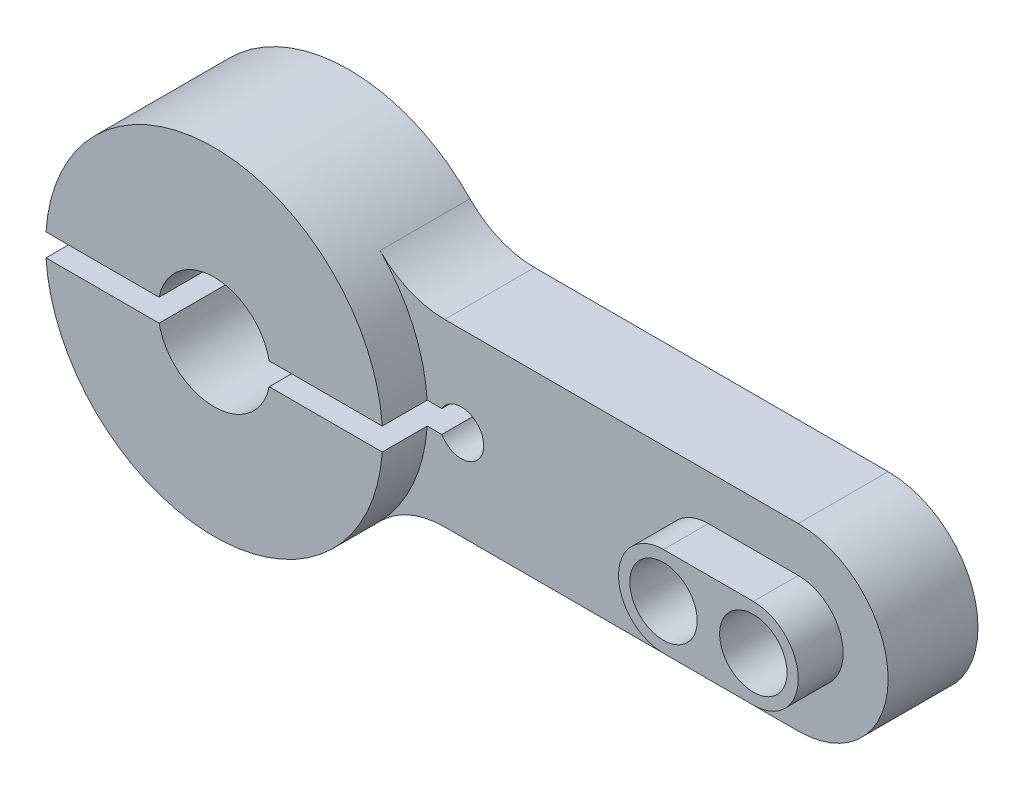
ISO-10303-21;
HEADER;
FILE_DESCRIPTION(('STEP AP214'),'2;1');
FILE_NAME('part.step','',(''),(''),'','','');
FILE_SCHEMA(('AUTOMOTIVE_DESIGN { 1 0 10303 214 1 1 1 1 }'));
ENDSEC;
DATA;
#1=APPLICATION_CONTEXT('core data for automotive mechanical design processes');
#2=APPLICATION_PROTOCOL_DEFINITION('international standard','automotive_design',2000,#1);
#3=PRODUCT_CONTEXT('',#1,'mechanical');
#4=PRODUCT('Part','Part','',(#3));
#5=PRODUCT_RELATED_PRODUCT_CATEGORY('part','',(#4));
#6=PRODUCT_DEFINITION_FORMATION('','',#4);
#7=PRODUCT_DEFINITION_CONTEXT('part definition',#1,'design');
#8=PRODUCT_DEFINITION('design','',#6,#7);
#9=PRODUCT_DEFINITION_SHAPE('','',#8);
#10=(LENGTH_UNIT() NAMED_UNIT(*) SI_UNIT(.MILLI.,.METRE.));
#11=(NAMED_UNIT(*) PLANE_ANGLE_UNIT() SI_UNIT($,.RADIAN.));
#12=(NAMED_UNIT(*) SI_UNIT($,.STERADIAN.) SOLID_ANGLE_UNIT());
#13=UNCERTAINTY_MEASURE_WITH_UNIT(LENGTH_MEASURE(1.E-05),#10,'distance_accuracy_value','');
#14=(GEOMETRIC_REPRESENTATION_CONTEXT(3) GLOBAL_UNCERTAINTY_ASSIGNED_CONTEXT((#13)) GLOBAL_UNIT_ASSIGNED_CONTEXT((#10,
#11,#12)) REPRESENTATION_CONTEXT('',''));
#15=CARTESIAN_POINT('',(0.,0.,0.));
#16=DIRECTION('',(0.,0.,1.));
#17=DIRECTION('',(1.,0.,0.));
#18=AXIS2_PLACEMENT_3D('',#15,#16,#17);
#19=CARTESIAN_POINT('',(0.,0.,0.));
#20=DIRECTION('',(0.,0.,1.));
#21=DIRECTION('',(1.,0.,0.));
#22=AXIS2_PLACEMENT_3D('',#19,#20,#21);
#23=CYLINDRICAL_SURFACE('',#22,2.5);
#24=CARTESIAN_POINT('',(0.,0.,2.032));
#25=DIRECTION('',(0.,0.,-1.));
#26=DIRECTION('',(-1.,0.,0.));
#27=AXIS2_PLACEMENT_3D('',#24,#25,#26);
#28=CIRCLE('',#27,2.5);
#29=CARTESIAN_POINT('',(2.44948974278318,-0.5,2.032));
#30=VERTEX_POINT('',#29);
#31=CARTESIAN_POINT('',(-2.44948974278318,-0.5,2.032));
#32=VERTEX_POINT('',#31);
#33=EDGE_CURVE('E239',#30,#32,#28,.T.);
#34=ORIENTED_EDGE('',*,*,#33,.T.);
#35=DIRECTION('',(0.,0.,1.));
#36=VECTOR('',#35,1.);
#37=CARTESIAN_POINT('',(-2.44948974278318,-0.5,0.));
#38=LINE('',#37,#36);
#39=CARTESIAN_POINT('',(-2.44948974278318,-0.5,6.));
#40=VERTEX_POINT('',#39);
#41=EDGE_CURVE('E429',#32,#40,#38,.T.);
#42=ORIENTED_EDGE('',*,*,#41,.T.);
#43=CARTESIAN_POINT('',(0.,0.,6.));
#44=DIRECTION('',(0.,0.,1.));
#45=DIRECTION('',(1.,0.,0.));
#46=AXIS2_PLACEMENT_3D('',#43,#44,#45);
#47=CIRCLE('',#46,2.5);
#48=CARTESIAN_POINT('',(2.44948974278318,-0.5,6.));
#49=VERTEX_POINT('',#48);
#50=EDGE_CURVE('E320',#40,#49,#47,.T.);
#51=ORIENTED_EDGE('',*,*,#50,.T.);
#52=DIRECTION('',(0.,0.,1.));
#53=VECTOR('',#52,1.);
#54=CARTESIAN_POINT('',(2.44948974278318,-0.5,0.));
#55=LINE('',#54,#53);
#56=EDGE_CURVE('E44',#49,#30,#55,.F.);
#57=ORIENTED_EDGE('',*,*,#56,.T.);
#58=EDGE_LOOP('',(#34,#42,#51,#57));
#59=FACE_BOUND('',#58,.T.);
#60=ADVANCED_FACE('F36',(#59),#23,.F.);
#61=CARTESIAN_POINT('',(0.,0.,0.762));
#62=DIRECTION('',(0.,0.,-1.));
#63=DIRECTION('',(1.,0.,0.));
#64=AXIS2_PLACEMENT_3D('',#61,#62,#63);
#65=CIRCLE('',#64,2.5);
#66=CARTESIAN_POINT('',(-2.44948974278318,0.5,0.762));
#67=VERTEX_POINT('',#66);
#68=CARTESIAN_POINT('',(2.44948974278318,0.5,0.762));
#69=VERTEX_POINT('',#68);
#70=EDGE_CURVE('E253',#67,#69,#65,.T.);
#71=ORIENTED_EDGE('',*,*,#70,.F.);
#72=DIRECTION('',(0.,0.,1.));
#73=VECTOR('',#72,1.);
#74=CARTESIAN_POINT('',(-2.44948974278318,0.5,0.));
#75=LINE('',#74,#73);
#76=CARTESIAN_POINT('',(-2.44948974278318,0.5,0.));
#77=VERTEX_POINT('',#76);
#78=EDGE_CURVE('E426',#67,#77,#75,.F.);
#79=ORIENTED_EDGE('',*,*,#78,.T.);
#80=CARTESIAN_POINT('',(0.,0.,0.));
#81=DIRECTION('',(0.,0.,1.));
#82=DIRECTION('',(1.,0.,0.));
#83=AXIS2_PLACEMENT_3D('',#80,#81,#82);
#84=CIRCLE('',#83,2.5);
#85=CARTESIAN_POINT('',(2.44948974278318,0.5,0.));
#86=VERTEX_POINT('',#85);
#87=EDGE_CURVE('E328',#86,#77,#84,.T.);
#88=ORIENTED_EDGE('',*,*,#87,.F.);
#89=DIRECTION('',(0.,0.,1.));
#90=VECTOR('',#89,1.);
#91=CARTESIAN_POINT('',(2.44948974278318,0.5,0.));
#92=LINE('',#91,#90);
#93=EDGE_CURVE('E424',#86,#69,#92,.T.);
#94=ORIENTED_EDGE('',*,*,#93,.T.);
#95=EDGE_LOOP('',(#71,#79,#88,#94));
#96=FACE_BOUND('',#95,.T.);
#97=ADVANCED_FACE('F457',(#96),#23,.F.);
#98=CARTESIAN_POINT('',(0.,0.,6.));
#99=DIRECTION('',(0.,0.,-1.));
#100=DIRECTION('',(-1.,0.,0.));
#101=AXIS2_PLACEMENT_3D('',#98,#99,#100);
#102=CYLINDRICAL_SURFACE('',#101,7.5);
#103=CARTESIAN_POINT('',(0.,0.,6.));
#104=DIRECTION('',(0.,0.,1.));
#105=DIRECTION('',(1.,0.,0.));
#106=AXIS2_PLACEMENT_3D('',#103,#104,#105);
#107=CIRCLE('',#106,7.5);
#108=CARTESIAN_POINT('',(-7.48331477354788,-0.5,6.));
#109=VERTEX_POINT('',#108);
#110=CARTESIAN_POINT('',(7.48331477354788,-0.5,6.));
#111=VERTEX_POINT('',#110);
#112=EDGE_CURVE('E392',#109,#111,#107,.T.);
#113=ORIENTED_EDGE('',*,*,#112,.F.);
#114=DIRECTION('',(0.,0.,-1.));
#115=VECTOR('',#114,1.);
#116=CARTESIAN_POINT('',(-7.48331477354788,-0.5,6.));
#117=LINE('',#116,#115);
#118=CARTESIAN_POINT('',(-7.48331477354788,-0.5,0.));
#119=VERTEX_POINT('',#118);
#120=EDGE_CURVE('E317',#109,#119,#117,.T.);
#121=ORIENTED_EDGE('',*,*,#120,.T.);
#122=CARTESIAN_POINT('',(0.,0.,0.));
#123=DIRECTION('',(0.,0.,1.));
#124=DIRECTION('',(1.,0.,0.));
#125=AXIS2_PLACEMENT_3D('',#122,#123,#124);
#126=CIRCLE('',#125,7.5);
#127=CARTESIAN_POINT('',(5.38784075277988,-5.21739130434783,0.));
#128=VERTEX_POINT('',#127);
#129=EDGE_CURVE('E387',#119,#128,#126,.T.);
#130=ORIENTED_EDGE('',*,*,#129,.T.);
#131=DIRECTION('',(0.,0.,-1.));
#132=VECTOR('',#131,1.);
#133=CARTESIAN_POINT('',(5.38784075277988,-5.21739130434783,6.));
#134=LINE('',#133,#132);
#135=CARTESIAN_POINT('',(5.38784075277988,-5.21739130434783,4.));
#136=VERTEX_POINT('',#135);
#137=EDGE_CURVE('E412',#128,#136,#134,.F.);
#138=ORIENTED_EDGE('',*,*,#137,.T.);
#139=CARTESIAN_POINT('',(0.,0.,4.));
#140=DIRECTION('',(0.,0.,-1.));
#141=DIRECTION('',(1.,0.,0.));
#142=AXIS2_PLACEMENT_3D('',#139,#140,#141);
#143=CIRCLE('',#142,7.5);
#144=CARTESIAN_POINT('',(7.48331477354788,-0.500000000000001,4.));
#145=VERTEX_POINT('',#144);
#146=EDGE_CURVE('E383',#145,#136,#143,.T.);
#147=ORIENTED_EDGE('',*,*,#146,.F.);
#148=DIRECTION('',(0.,0.,-1.));
#149=VECTOR('',#148,1.);
#150=CARTESIAN_POINT('',(7.48331477354788,-0.5,6.));
#151=LINE('',#150,#149);
#152=EDGE_CURVE('E314',#145,#111,#151,.F.);
#153=ORIENTED_EDGE('',*,*,#152,.T.);
#154=EDGE_LOOP('',(#113,#121,#130,#138,#147,#153));
#155=FACE_BOUND('',#154,.T.);
#156=ADVANCED_FACE('F449',(#155),#102,.T.);
#157=CARTESIAN_POINT('',(0.,0.,6.));
#158=DIRECTION('',(0.,0.,1.));
#159=DIRECTION('',(1.,0.,0.));
#160=AXIS2_PLACEMENT_3D('',#157,#158,#159);
#161=PLANE('',#160);
#162=DIRECTION('',(1.,0.,0.));
#163=VECTOR('',#162,1.);
#164=CARTESIAN_POINT('',(8.13397459621556,-0.5,6.));
#165=LINE('',#164,#163);
#166=EDGE_CURVE('E286',#109,#40,#165,.T.);
#167=ORIENTED_EDGE('',*,*,#166,.F.);
#168=ORIENTED_EDGE('',*,*,#112,.T.);
#169=EDGE_CURVE('E296',#49,#111,#165,.T.);
#170=ORIENTED_EDGE('',*,*,#169,.F.);
#171=ORIENTED_EDGE('',*,*,#50,.F.);
#172=EDGE_LOOP('',(#167,#168,#170,#171));
#173=FACE_BOUND('',#172,.T.);
#174=ADVANCED_FACE('F454',(#173),#161,.T.);
#175=CARTESIAN_POINT('',(-2.44948974278318,-0.5,0.));
#176=VERTEX_POINT('',#175);
#177=CARTESIAN_POINT('',(-2.44948974278318,-0.5,0.762));
#178=VERTEX_POINT('',#177);
#179=EDGE_CURVE('E430',#176,#178,#38,.T.);
#180=ORIENTED_EDGE('',*,*,#179,.T.);
#181=CARTESIAN_POINT('',(0.,0.,0.762));
#182=DIRECTION('',(0.,0.,-1.));
#183=DIRECTION('',(-1.,0.,0.));
#184=AXIS2_PLACEMENT_3D('',#181,#182,#183);
#185=CIRCLE('',#184,2.5);
#186=CARTESIAN_POINT('',(2.44948974278318,-0.5,0.762));
#187=VERTEX_POINT('',#186);
#188=EDGE_CURVE('E51',#187,#178,#185,.T.);
#189=ORIENTED_EDGE('',*,*,#188,.F.);
#190=CARTESIAN_POINT('',(2.44948974278318,-0.5,0.));
#191=VERTEX_POINT('',#190);
#192=EDGE_CURVE('E431',#187,#191,#55,.F.);
#193=ORIENTED_EDGE('',*,*,#192,.T.);
#194=EDGE_CURVE('E331',#176,#191,#84,.T.);
#195=ORIENTED_EDGE('',*,*,#194,.F.);
#196=EDGE_LOOP('',(#180,#189,#193,#195));
#197=FACE_BOUND('',#196,.T.);
#198=ADVANCED_FACE('F434',(#197),#23,.F.);
#199=CARTESIAN_POINT('',(6.34428877022476,-4.,6.));
#200=DIRECTION('',(0.,1.,0.));
#201=DIRECTION('',(0.,0.,1.));
#202=AXIS2_PLACEMENT_3D('',#199,#200,#201);
#203=PLANE('',#202);
#204=DIRECTION('',(1.,0.,0.));
#205=VECTOR('',#204,1.);
#206=CARTESIAN_POINT('',(8.26135582092915,-4.,4.));
#207=LINE('',#206,#205);
#208=CARTESIAN_POINT('',(8.26135582092915,-4.,4.));
#209=VERTEX_POINT('',#208);
#210=CARTESIAN_POINT('',(24.,-4.,4.));
#211=VERTEX_POINT('',#210);
#212=EDGE_CURVE('E375',#209,#211,#207,.T.);
#213=ORIENTED_EDGE('',*,*,#212,.F.);
#214=DIRECTION('',(0.,0.,1.));
#215=VECTOR('',#214,1.);
#216=CARTESIAN_POINT('',(8.26135582092915,-4.,0.));
#217=LINE('',#216,#215);
#218=CARTESIAN_POINT('',(8.26135582092915,-4.,0.));
#219=VERTEX_POINT('',#218);
#220=EDGE_CURVE('E408',#209,#219,#217,.F.);
#221=ORIENTED_EDGE('',*,*,#220,.T.);
#222=DIRECTION('',(1.,0.,0.));
#223=VECTOR('',#222,1.);
#224=CARTESIAN_POINT('',(6.34428877022476,-4.,0.));
#225=LINE('',#224,#223);
#226=CARTESIAN_POINT('',(24.,-4.,0.));
#227=VERTEX_POINT('',#226);
#228=EDGE_CURVE('E396',#219,#227,#225,.T.);
#229=ORIENTED_EDGE('',*,*,#228,.T.);
#230=DIRECTION('',(0.,0.,-1.));
#231=VECTOR('',#230,1.);
#232=CARTESIAN_POINT('',(24.,-4.,6.));
#233=LINE('',#232,#231);
#234=EDGE_CURVE('E406',#211,#227,#233,.T.);
#235=ORIENTED_EDGE('',*,*,#234,.F.);
#236=EDGE_LOOP('',(#213,#221,#229,#235));
#237=FACE_BOUND('',#236,.T.);
#238=ADVANCED_FACE('F480',(#237),#203,.F.);
#239=CARTESIAN_POINT('',(24.,0.,6.));
#240=DIRECTION('',(0.,0.,-1.));
#241=DIRECTION('',(-1.,0.,0.));
#242=AXIS2_PLACEMENT_3D('',#239,#240,#241);
#243=CYLINDRICAL_SURFACE('',#242,4.);
#244=CARTESIAN_POINT('',(24.,0.,4.));
#245=DIRECTION('',(0.,0.,1.));
#246=DIRECTION('',(1.,0.,0.));
#247=AXIS2_PLACEMENT_3D('',#244,#245,#246);
#248=CIRCLE('',#247,4.);
#249=CARTESIAN_POINT('',(24.,4.,4.));
#250=VERTEX_POINT('',#249);
#251=EDGE_CURVE('E377',#211,#250,#248,.T.);
#252=ORIENTED_EDGE('',*,*,#251,.F.);
#253=ORIENTED_EDGE('',*,*,#234,.T.);
#254=CARTESIAN_POINT('',(24.,0.,0.));
#255=DIRECTION('',(0.,0.,1.));
#256=DIRECTION('',(-1.,0.,0.));
#257=AXIS2_PLACEMENT_3D('',#254,#255,#256);
#258=CIRCLE('',#257,4.);
#259=CARTESIAN_POINT('',(24.,4.,0.));
#260=VERTEX_POINT('',#259);
#261=EDGE_CURVE('E399',#227,#260,#258,.T.);
#262=ORIENTED_EDGE('',*,*,#261,.T.);
#263=DIRECTION('',(0.,0.,-1.));
#264=VECTOR('',#263,1.);
#265=CARTESIAN_POINT('',(24.,4.,6.));
#266=LINE('',#265,#264);
#267=EDGE_CURVE('E391',#250,#260,#266,.T.);
#268=ORIENTED_EDGE('',*,*,#267,.F.);
#269=EDGE_LOOP('',(#252,#253,#262,#268));
#270=FACE_BOUND('',#269,.T.);
#271=ADVANCED_FACE('F485',(#270),#243,.T.);
#272=CARTESIAN_POINT('',(6.34428877022476,4.,6.));
#273=DIRECTION('',(0.,-1.,0.));
#274=DIRECTION('',(0.,0.,-1.));
#275=AXIS2_PLACEMENT_3D('',#272,#273,#274);
#276=PLANE('',#275);
#277=DIRECTION('',(-1.,0.,0.));
#278=VECTOR('',#277,1.);
#279=CARTESIAN_POINT('',(24.,4.,4.));
#280=LINE('',#279,#278);
#281=CARTESIAN_POINT('',(8.26135582092915,4.,4.));
#282=VERTEX_POINT('',#281);
#283=EDGE_CURVE('E379',#250,#282,#280,.T.);
#284=ORIENTED_EDGE('',*,*,#283,.F.);
#285=ORIENTED_EDGE('',*,*,#267,.T.);
#286=DIRECTION('',(-1.,0.,0.));
#287=VECTOR('',#286,1.);
#288=CARTESIAN_POINT('',(6.34428877022476,4.,0.));
#289=LINE('',#288,#287);
#290=CARTESIAN_POINT('',(8.26135582092915,4.,0.));
#291=VERTEX_POINT('',#290);
#292=EDGE_CURVE('E402',#260,#291,#289,.T.);
#293=ORIENTED_EDGE('',*,*,#292,.T.);
#294=DIRECTION('',(0.,0.,1.));
#295=VECTOR('',#294,1.);
#296=CARTESIAN_POINT('',(8.26135582092915,4.,6.));
#297=LINE('',#296,#295);
#298=EDGE_CURVE('E415',#291,#282,#297,.T.);
#299=ORIENTED_EDGE('',*,*,#298,.T.);
#300=EDGE_LOOP('',(#284,#285,#293,#299));
#301=FACE_BOUND('',#300,.T.);
#302=ADVANCED_FACE('F552',(#301),#276,.F.);
#303=CARTESIAN_POINT('',(8.26135582092915,-8.,6.));
#304=DIRECTION('',(0.,0.,-1.));
#305=DIRECTION('',(-1.,0.,0.));
#306=AXIS2_PLACEMENT_3D('',#303,#304,#305);
#307=CYLINDRICAL_SURFACE('',#306,4.);
#308=CARTESIAN_POINT('',(8.26135582092915,-8.,4.));
#309=DIRECTION('',(0.,0.,-1.));
#310=DIRECTION('',(1.,0.,0.));
#311=AXIS2_PLACEMENT_3D('',#308,#309,#310);
#312=CIRCLE('',#311,4.);
#313=EDGE_CURVE('E367',#136,#209,#312,.T.);
#314=ORIENTED_EDGE('',*,*,#313,.F.);
#315=ORIENTED_EDGE('',*,*,#137,.F.);
#316=CARTESIAN_POINT('',(8.26135582092915,-8.,0.));
#317=DIRECTION('',(0.,0.,1.));
#318=DIRECTION('',(1.,0.,0.));
#319=AXIS2_PLACEMENT_3D('',#316,#317,#318);
#320=CIRCLE('',#319,4.);
#321=EDGE_CURVE('E418',#219,#128,#320,.T.);
#322=ORIENTED_EDGE('',*,*,#321,.F.);
#323=ORIENTED_EDGE('',*,*,#220,.F.);
#324=EDGE_LOOP('',(#314,#315,#322,#323));
#325=FACE_BOUND('',#324,.T.);
#326=ADVANCED_FACE('F564',(#325),#307,.F.);
#327=CARTESIAN_POINT('',(8.26135582092915,8.,6.));
#328=DIRECTION('',(0.,0.,-1.));
#329=DIRECTION('',(-1.,0.,0.));
#330=AXIS2_PLACEMENT_3D('',#327,#328,#329);
#331=CYLINDRICAL_SURFACE('',#330,4.);
#332=CARTESIAN_POINT('',(8.26135582092915,8.,4.));
#333=DIRECTION('',(0.,0.,-1.));
#334=DIRECTION('',(1.,0.,0.));
#335=AXIS2_PLACEMENT_3D('',#332,#333,#334);
#336=CIRCLE('',#335,4.);
#337=CARTESIAN_POINT('',(5.38784075277988,5.21739130434783,4.));
#338=VERTEX_POINT('',#337);
#339=EDGE_CURVE('E381',#282,#338,#336,.T.);
#340=ORIENTED_EDGE('',*,*,#339,.F.);
#341=ORIENTED_EDGE('',*,*,#298,.F.);
#342=CARTESIAN_POINT('',(8.26135582092915,8.,0.));
#343=DIRECTION('',(0.,0.,1.));
#344=DIRECTION('',(1.,0.,0.));
#345=AXIS2_PLACEMENT_3D('',#342,#343,#344);
#346=CIRCLE('',#345,4.);
#347=CARTESIAN_POINT('',(5.38784075277988,5.21739130434783,0.));
#348=VERTEX_POINT('',#347);
#349=EDGE_CURVE('E421',#348,#291,#346,.T.);
#350=ORIENTED_EDGE('',*,*,#349,.F.);
#351=DIRECTION('',(0.,0.,-1.));
#352=VECTOR('',#351,1.);
#353=CARTESIAN_POINT('',(5.38784075277988,5.21739130434783,6.));
#354=LINE('',#353,#352);
#355=EDGE_CURVE('E410',#338,#348,#354,.T.);
#356=ORIENTED_EDGE('',*,*,#355,.F.);
#357=EDGE_LOOP('',(#340,#341,#350,#356));
#358=FACE_BOUND('',#357,.T.);
#359=ADVANCED_FACE('F38',(#358),#331,.F.);
#360=CARTESIAN_POINT('',(7.48331477354788,0.5,6.));
#361=VERTEX_POINT('',#360);
#362=CARTESIAN_POINT('',(-7.48331477354788,0.5,6.));
#363=VERTEX_POINT('',#362);
#364=EDGE_CURVE('E388',#361,#363,#107,.T.);
#365=ORIENTED_EDGE('',*,*,#364,.F.);
#366=DIRECTION('',(0.,0.,-1.));
#367=VECTOR('',#366,1.);
#368=CARTESIAN_POINT('',(7.48331477354788,0.5,6.));
#369=LINE('',#368,#367);
#370=CARTESIAN_POINT('',(7.48331477354788,0.5,4.));
#371=VERTEX_POINT('',#370);
#372=EDGE_CURVE('E306',#361,#371,#369,.T.);
#373=ORIENTED_EDGE('',*,*,#372,.T.);
#374=EDGE_CURVE('E384',#338,#371,#143,.T.);
#375=ORIENTED_EDGE('',*,*,#374,.F.);
#376=ORIENTED_EDGE('',*,*,#355,.T.);
#377=CARTESIAN_POINT('',(-7.48331477354788,0.5,0.));
#378=VERTEX_POINT('',#377);
#379=EDGE_CURVE('E393',#348,#378,#126,.T.);
#380=ORIENTED_EDGE('',*,*,#379,.T.);
#381=DIRECTION('',(0.,0.,-1.));
#382=VECTOR('',#381,1.);
#383=CARTESIAN_POINT('',(-7.48331477354788,0.5,6.));
#384=LINE('',#383,#382);
#385=EDGE_CURVE('E309',#378,#363,#384,.F.);
#386=ORIENTED_EDGE('',*,*,#385,.T.);
#387=EDGE_LOOP('',(#365,#373,#375,#376,#380,#386));
#388=FACE_BOUND('',#387,.T.);
#389=ADVANCED_FACE('F495',(#388),#102,.T.);
#390=DIRECTION('',(-1.,0.,0.));
#391=VECTOR('',#390,1.);
#392=CARTESIAN_POINT('',(-8.07942286368343,0.5,6.));
#393=LINE('',#392,#391);
#394=CARTESIAN_POINT('',(2.44948974278318,0.5,6.));
#395=VERTEX_POINT('',#394);
#396=EDGE_CURVE('E295',#361,#395,#393,.T.);
#397=ORIENTED_EDGE('',*,*,#396,.F.);
#398=ORIENTED_EDGE('',*,*,#364,.T.);
#399=CARTESIAN_POINT('',(-2.44948974278318,0.5,6.));
#400=VERTEX_POINT('',#399);
#401=EDGE_CURVE('E280',#400,#363,#393,.T.);
#402=ORIENTED_EDGE('',*,*,#401,.F.);
#403=EDGE_CURVE('E332',#395,#400,#47,.T.);
#404=ORIENTED_EDGE('',*,*,#403,.F.);
#405=EDGE_LOOP('',(#397,#398,#402,#404));
#406=FACE_BOUND('',#405,.T.);
#407=ADVANCED_FACE('F490',(#406),#161,.T.);
#408=CARTESIAN_POINT('',(0.,0.,0.));
#409=DIRECTION('',(0.,0.,1.));
#410=DIRECTION('',(1.,0.,0.));
#411=AXIS2_PLACEMENT_3D('',#408,#409,#410);
#412=PLANE('',#411);
#413=ORIENTED_EDGE('',*,*,#129,.F.);
#414=DIRECTION('',(1.,0.,0.));
#415=VECTOR('',#414,1.);
#416=CARTESIAN_POINT('',(8.13397459621556,-0.5,0.));
#417=LINE('',#416,#415);
#418=EDGE_CURVE('E293',#119,#176,#417,.T.);
#419=ORIENTED_EDGE('',*,*,#418,.T.);
#420=ORIENTED_EDGE('',*,*,#194,.T.);
#421=CARTESIAN_POINT('',(8.13397459621556,-0.5,0.));
#422=VERTEX_POINT('',#421);
#423=EDGE_CURVE('E290',#191,#422,#417,.T.);
#424=ORIENTED_EDGE('',*,*,#423,.T.);
#425=CARTESIAN_POINT('',(9.,0.,0.));
#426=DIRECTION('',(0.,0.,1.));
#427=DIRECTION('',(1.,0.,0.));
#428=AXIS2_PLACEMENT_3D('',#425,#426,#427);
#429=CIRCLE('',#428,1.);
#430=CARTESIAN_POINT('',(8.13397459621556,0.5,0.));
#431=VERTEX_POINT('',#430);
#432=EDGE_CURVE('E282',#422,#431,#429,.T.);
#433=ORIENTED_EDGE('',*,*,#432,.T.);
#434=DIRECTION('',(-1.,0.,0.));
#435=VECTOR('',#434,1.);
#436=CARTESIAN_POINT('',(-8.07942286368343,0.5,0.));
#437=LINE('',#436,#435);
#438=EDGE_CURVE('E287',#431,#86,#437,.T.);
#439=ORIENTED_EDGE('',*,*,#438,.T.);
#440=ORIENTED_EDGE('',*,*,#87,.T.);
#441=EDGE_CURVE('E285',#77,#378,#437,.T.);
#442=ORIENTED_EDGE('',*,*,#441,.T.);
#443=ORIENTED_EDGE('',*,*,#379,.F.);
#444=ORIENTED_EDGE('',*,*,#349,.T.);
#445=ORIENTED_EDGE('',*,*,#292,.F.);
#446=ORIENTED_EDGE('',*,*,#261,.F.);
#447=ORIENTED_EDGE('',*,*,#228,.F.);
#448=ORIENTED_EDGE('',*,*,#321,.T.);
#449=EDGE_LOOP('',(#413,#419,#420,#424,#433,#439,#440,#442,#443,#444,#445,#446,#447,#448));
#450=FACE_BOUND('',#449,.T.);
#451=CARTESIAN_POINT('',(24.,0.,0.));
#452=DIRECTION('',(0.,0.,1.));
#453=DIRECTION('',(1.,0.,0.));
#454=AXIS2_PLACEMENT_3D('',#451,#452,#453);
#455=CIRCLE('',#454,1.5);
#456=CARTESIAN_POINT('',(25.5,0.,0.));
#457=VERTEX_POINT('',#456);
#458=EDGE_CURVE('E321',#457,#457,#455,.T.);
#459=ORIENTED_EDGE('',*,*,#458,.T.);
#460=EDGE_LOOP('',(#459));
#461=FACE_BOUND('',#460,.T.);
#462=CARTESIAN_POINT('',(20.,0.,0.));
#463=DIRECTION('',(0.,0.,1.));
#464=DIRECTION('',(1.,0.,0.));
#465=AXIS2_PLACEMENT_3D('',#462,#463,#464);
#466=CIRCLE('',#465,1.5);
#467=CARTESIAN_POINT('',(21.5,0.,0.));
#468=VERTEX_POINT('',#467);
#469=EDGE_CURVE('E335',#468,#468,#466,.T.);
#470=ORIENTED_EDGE('',*,*,#469,.T.);
#471=EDGE_LOOP('',(#470));
#472=FACE_BOUND('',#471,.T.);
#473=ADVANCED_FACE('F440',(#450,#461,#472),#412,.F.);
#474=CARTESIAN_POINT('',(8.26135582092915,-8.,4.));
#475=DIRECTION('',(0.,0.,1.));
#476=DIRECTION('',(1.,0.,0.));
#477=AXIS2_PLACEMENT_3D('',#474,#475,#476);
#478=PLANE('',#477);
#479=DIRECTION('',(1.,0.,0.));
#480=VECTOR('',#479,1.);
#481=CARTESIAN_POINT('',(8.26135582092915,-0.5,4.));
#482=LINE('',#481,#480);
#483=CARTESIAN_POINT('',(8.13397459621556,-0.5,4.));
#484=VERTEX_POINT('',#483);
#485=EDGE_CURVE('E312',#145,#484,#482,.T.);
#486=ORIENTED_EDGE('',*,*,#485,.F.);
#487=ORIENTED_EDGE('',*,*,#146,.T.);
#488=ORIENTED_EDGE('',*,*,#313,.T.);
#489=ORIENTED_EDGE('',*,*,#212,.T.);
#490=ORIENTED_EDGE('',*,*,#251,.T.);
#491=ORIENTED_EDGE('',*,*,#283,.T.);
#492=ORIENTED_EDGE('',*,*,#339,.T.);
#493=ORIENTED_EDGE('',*,*,#374,.T.);
#494=DIRECTION('',(-1.,0.,0.));
#495=VECTOR('',#494,1.);
#496=CARTESIAN_POINT('',(8.26135582092915,0.5,4.));
#497=LINE('',#496,#495);
#498=CARTESIAN_POINT('',(8.13397459621556,0.5,4.));
#499=VERTEX_POINT('',#498);
#500=EDGE_CURVE('E301',#499,#371,#497,.T.);
#501=ORIENTED_EDGE('',*,*,#500,.F.);
#502=CARTESIAN_POINT('',(9.,0.,4.));
#503=DIRECTION('',(0.,0.,1.));
#504=DIRECTION('',(1.,0.,0.));
#505=AXIS2_PLACEMENT_3D('',#502,#503,#504);
#506=CIRCLE('',#505,1.);
#507=EDGE_CURVE('E11',#484,#499,#506,.T.);
#508=ORIENTED_EDGE('',*,*,#507,.F.);
#509=EDGE_LOOP('',(#486,#487,#488,#489,#490,#491,#492,#493,#501,#508));
#510=FACE_BOUND('',#509,.T.);
#511=DIRECTION('',(-1.,0.,0.));
#512=VECTOR('',#511,1.);
#513=CARTESIAN_POINT('',(20.,2.,4.));
#514=LINE('',#513,#512);
#515=CARTESIAN_POINT('',(24.,2.,4.));
#516=VERTEX_POINT('',#515);
#517=CARTESIAN_POINT('',(20.,2.,4.));
#518=VERTEX_POINT('',#517);
#519=EDGE_CURVE('E351',#516,#518,#514,.T.);
#520=ORIENTED_EDGE('',*,*,#519,.F.);
#521=CARTESIAN_POINT('',(24.,0.,4.));
#522=DIRECTION('',(0.,0.,1.));
#523=DIRECTION('',(1.,0.,0.));
#524=AXIS2_PLACEMENT_3D('',#521,#522,#523);
#525=CIRCLE('',#524,2.);
#526=CARTESIAN_POINT('',(24.,-2.,4.));
#527=VERTEX_POINT('',#526);
#528=EDGE_CURVE('E348',#527,#516,#525,.T.);
#529=ORIENTED_EDGE('',*,*,#528,.F.);
#530=DIRECTION('',(1.,0.,0.));
#531=VECTOR('',#530,1.);
#532=CARTESIAN_POINT('',(20.,-2.,4.));
#533=LINE('',#532,#531);
#534=CARTESIAN_POINT('',(20.,-2.,4.));
#535=VERTEX_POINT('',#534);
#536=EDGE_CURVE('E344',#535,#527,#533,.T.);
#537=ORIENTED_EDGE('',*,*,#536,.F.);
#538=CARTESIAN_POINT('',(20.,0.,4.));
#539=DIRECTION('',(0.,0.,1.));
#540=DIRECTION('',(1.,0.,0.));
#541=AXIS2_PLACEMENT_3D('',#538,#539,#540);
#542=CIRCLE('',#541,2.);
#543=EDGE_CURVE('E341',#518,#535,#542,.T.);
#544=ORIENTED_EDGE('',*,*,#543,.F.);
#545=EDGE_LOOP('',(#520,#529,#537,#544));
#546=FACE_BOUND('',#545,.T.);
#547=ADVANCED_FACE('F507',(#510,#546),#478,.T.);
#548=CARTESIAN_POINT('',(20.,0.,4.));
#549=DIRECTION('',(0.,0.,1.));
#550=DIRECTION('',(1.,0.,0.));
#551=AXIS2_PLACEMENT_3D('',#548,#549,#550);
#552=CYLINDRICAL_SURFACE('',#551,2.);
#553=CARTESIAN_POINT('',(20.,0.,6.));
#554=DIRECTION('',(0.,0.,1.));
#555=DIRECTION('',(1.,0.,0.));
#556=AXIS2_PLACEMENT_3D('',#553,#554,#555);
#557=CIRCLE('',#556,2.);
#558=CARTESIAN_POINT('',(20.,2.,6.));
#559=VERTEX_POINT('',#558);
#560=CARTESIAN_POINT('',(20.,-2.,6.));
#561=VERTEX_POINT('',#560);
#562=EDGE_CURVE('E338',#559,#561,#557,.T.);
#563=ORIENTED_EDGE('',*,*,#562,.F.);
#564=DIRECTION('',(0.,0.,1.));
#565=VECTOR('',#564,1.);
#566=CARTESIAN_POINT('',(20.,2.,4.));
#567=LINE('',#566,#565);
#568=EDGE_CURVE('E365',#518,#559,#567,.T.);
#569=ORIENTED_EDGE('',*,*,#568,.F.);
#570=ORIENTED_EDGE('',*,*,#543,.T.);
#571=DIRECTION('',(0.,0.,1.));
#572=VECTOR('',#571,1.);
#573=CARTESIAN_POINT('',(20.,-2.,4.));
#574=LINE('',#573,#572);
#575=EDGE_CURVE('E354',#535,#561,#574,.T.);
#576=ORIENTED_EDGE('',*,*,#575,.T.);
#577=EDGE_LOOP('',(#563,#569,#570,#576));
#578=FACE_BOUND('',#577,.T.);
#579=ADVANCED_FACE('F598',(#578),#552,.T.);
#580=CARTESIAN_POINT('',(20.,2.,4.));
#581=DIRECTION('',(0.,1.,0.));
#582=DIRECTION('',(0.,0.,1.));
#583=AXIS2_PLACEMENT_3D('',#580,#581,#582);
#584=PLANE('',#583);
#585=DIRECTION('',(-1.,0.,0.));
#586=VECTOR('',#585,1.);
#587=CARTESIAN_POINT('',(20.,2.,6.));
#588=LINE('',#587,#586);
#589=CARTESIAN_POINT('',(24.,2.,6.));
#590=VERTEX_POINT('',#589);
#591=EDGE_CURVE('E345',#590,#559,#588,.T.);
#592=ORIENTED_EDGE('',*,*,#591,.F.);
#593=DIRECTION('',(0.,0.,1.));
#594=VECTOR('',#593,1.);
#595=CARTESIAN_POINT('',(24.,2.,4.));
#596=LINE('',#595,#594);
#597=EDGE_CURVE('E368',#516,#590,#596,.T.);
#598=ORIENTED_EDGE('',*,*,#597,.F.);
#599=ORIENTED_EDGE('',*,*,#519,.T.);
#600=ORIENTED_EDGE('',*,*,#568,.T.);
#601=EDGE_LOOP('',(#592,#598,#599,#600));
#602=FACE_BOUND('',#601,.T.);
#603=ADVANCED_FACE('F603',(#602),#584,.T.);
#604=CARTESIAN_POINT('',(24.,0.,4.));
#605=DIRECTION('',(0.,0.,1.));
#606=DIRECTION('',(1.,0.,0.));
#607=AXIS2_PLACEMENT_3D('',#604,#605,#606);
#608=CYLINDRICAL_SURFACE('',#607,2.);
#609=CARTESIAN_POINT('',(24.,0.,6.));
#610=DIRECTION('',(0.,0.,1.));
#611=DIRECTION('',(1.,0.,0.));
#612=AXIS2_PLACEMENT_3D('',#609,#610,#611);
#613=CIRCLE('',#612,2.);
#614=CARTESIAN_POINT('',(24.,-2.,6.));
#615=VERTEX_POINT('',#614);
#616=EDGE_CURVE('E360',#615,#590,#613,.T.);
#617=ORIENTED_EDGE('',*,*,#616,.F.);
#618=DIRECTION('',(0.,0.,1.));
#619=VECTOR('',#618,1.);
#620=CARTESIAN_POINT('',(24.,-2.,4.));
#621=LINE('',#620,#619);
#622=EDGE_CURVE('E370',#527,#615,#621,.T.);
#623=ORIENTED_EDGE('',*,*,#622,.F.);
#624=ORIENTED_EDGE('',*,*,#528,.T.);
#625=ORIENTED_EDGE('',*,*,#597,.T.);
#626=EDGE_LOOP('',(#617,#623,#624,#625));
#627=FACE_BOUND('',#626,.T.);
#628=ADVANCED_FACE('F615',(#627),#608,.T.);
#629=CARTESIAN_POINT('',(20.,-2.,4.));
#630=DIRECTION('',(0.,-1.,0.));
#631=DIRECTION('',(0.,0.,-1.));
#632=AXIS2_PLACEMENT_3D('',#629,#630,#631);
#633=PLANE('',#632);
#634=DIRECTION('',(1.,0.,0.));
#635=VECTOR('',#634,1.);
#636=CARTESIAN_POINT('',(20.,-2.,6.));
#637=LINE('',#636,#635);
#638=EDGE_CURVE('E357',#561,#615,#637,.T.);
#639=ORIENTED_EDGE('',*,*,#638,.F.);
#640=ORIENTED_EDGE('',*,*,#575,.F.);
#641=ORIENTED_EDGE('',*,*,#536,.T.);
#642=ORIENTED_EDGE('',*,*,#622,.T.);
#643=EDGE_LOOP('',(#639,#640,#641,#642));
#644=FACE_BOUND('',#643,.T.);
#645=ADVANCED_FACE('F499',(#644),#633,.T.);
#646=CARTESIAN_POINT('',(24.,0.,6.));
#647=DIRECTION('',(0.,0.,1.));
#648=DIRECTION('',(1.,0.,0.));
#649=AXIS2_PLACEMENT_3D('',#646,#647,#648);
#650=CIRCLE('',#649,1.5);
#651=CARTESIAN_POINT('',(25.5,0.,6.));
#652=VERTEX_POINT('',#651);
#653=EDGE_CURVE('E325',#652,#652,#650,.T.);
#654=ORIENTED_EDGE('',*,*,#653,.F.);
#655=EDGE_LOOP('',(#654));
#656=FACE_BOUND('',#655,.T.);
#657=CARTESIAN_POINT('',(20.,0.,6.));
#658=DIRECTION('',(0.,0.,1.));
#659=DIRECTION('',(1.,0.,0.));
#660=AXIS2_PLACEMENT_3D('',#657,#658,#659);
#661=CIRCLE('',#660,1.5);
#662=CARTESIAN_POINT('',(21.5,0.,6.));
#663=VERTEX_POINT('',#662);
#664=EDGE_CURVE('E324',#663,#663,#661,.T.);
#665=ORIENTED_EDGE('',*,*,#664,.F.);
#666=EDGE_LOOP('',(#665));
#667=FACE_BOUND('',#666,.T.);
#668=ORIENTED_EDGE('',*,*,#591,.T.);
#669=ORIENTED_EDGE('',*,*,#562,.T.);
#670=ORIENTED_EDGE('',*,*,#638,.T.);
#671=ORIENTED_EDGE('',*,*,#616,.T.);
#672=EDGE_LOOP('',(#668,#669,#670,#671));
#673=FACE_BOUND('',#672,.T.);
#674=ADVANCED_FACE('F489',(#656,#667,#673),#161,.T.);
#675=CARTESIAN_POINT('',(20.,0.,0.));
#676=DIRECTION('',(0.,0.,1.));
#677=DIRECTION('',(1.,0.,0.));
#678=AXIS2_PLACEMENT_3D('',#675,#676,#677);
#679=CYLINDRICAL_SURFACE('',#678,1.5);
#680=ORIENTED_EDGE('',*,*,#469,.F.);
#681=EDGE_LOOP('',(#680));
#682=FACE_BOUND('',#681,.T.);
#683=ORIENTED_EDGE('',*,*,#664,.T.);
#684=EDGE_LOOP('',(#683));
#685=FACE_BOUND('',#684,.T.);
#686=ADVANCED_FACE('F477',(#682,#685),#679,.F.);
#687=CARTESIAN_POINT('',(24.,0.,0.));
#688=DIRECTION('',(0.,0.,1.));
#689=DIRECTION('',(1.,0.,0.));
#690=AXIS2_PLACEMENT_3D('',#687,#688,#689);
#691=CYLINDRICAL_SURFACE('',#690,1.5);
#692=ORIENTED_EDGE('',*,*,#458,.F.);
#693=EDGE_LOOP('',(#692));
#694=FACE_BOUND('',#693,.T.);
#695=ORIENTED_EDGE('',*,*,#653,.T.);
#696=EDGE_LOOP('',(#695));
#697=FACE_BOUND('',#696,.T.);
#698=ADVANCED_FACE('F468',(#694,#697),#691,.F.);
#699=CARTESIAN_POINT('',(-2.44948974278318,0.5,2.032));
#700=VERTEX_POINT('',#699);
#701=EDGE_CURVE('E427',#400,#700,#75,.F.);
#702=ORIENTED_EDGE('',*,*,#701,.T.);
#703=CARTESIAN_POINT('',(0.,0.,2.032));
#704=DIRECTION('',(0.,0.,-1.));
#705=DIRECTION('',(1.,0.,0.));
#706=AXIS2_PLACEMENT_3D('',#703,#704,#705);
#707=CIRCLE('',#706,2.5);
#708=CARTESIAN_POINT('',(2.44948974278318,0.5,2.032));
#709=VERTEX_POINT('',#708);
#710=EDGE_CURVE('E255',#700,#709,#707,.T.);
#711=ORIENTED_EDGE('',*,*,#710,.T.);
#712=EDGE_CURVE('E423',#709,#395,#92,.T.);
#713=ORIENTED_EDGE('',*,*,#712,.T.);
#714=ORIENTED_EDGE('',*,*,#403,.T.);
#715=EDGE_LOOP('',(#702,#711,#713,#714));
#716=FACE_BOUND('',#715,.T.);
#717=ADVANCED_FACE('F459',(#716),#23,.F.);
#718=CARTESIAN_POINT('',(-8.07942286368343,0.5,0.));
#719=DIRECTION('',(0.,1.,0.));
#720=DIRECTION('',(-1.,0.,0.));
#721=AXIS2_PLACEMENT_3D('',#718,#719,#720);
#722=PLANE('',#721);
#723=ORIENTED_EDGE('',*,*,#396,.T.);
#724=ORIENTED_EDGE('',*,*,#712,.F.);
#725=DIRECTION('',(-1.,0.,0.));
#726=VECTOR('',#725,1.);
#727=CARTESIAN_POINT('',(2.44948974278318,0.5,2.032));
#728=LINE('',#727,#726);
#729=CARTESIAN_POINT('',(0.656848726877049,0.5,2.032));
#730=VERTEX_POINT('',#729);
#731=EDGE_CURVE('E257',#709,#730,#728,.T.);
#732=ORIENTED_EDGE('',*,*,#731,.T.);
#733=DIRECTION('',(0.,0.,-1.));
#734=VECTOR('',#733,1.);
#735=CARTESIAN_POINT('',(0.656848726877049,0.5,2.032));
#736=LINE('',#735,#734);
#737=CARTESIAN_POINT('',(0.656848726877049,0.5,0.762));
#738=VERTEX_POINT('',#737);
#739=EDGE_CURVE('E267',#730,#738,#736,.T.);
#740=ORIENTED_EDGE('',*,*,#739,.T.);
#741=DIRECTION('',(-1.,0.,0.));
#742=VECTOR('',#741,1.);
#743=CARTESIAN_POINT('',(2.44948974278318,0.5,0.762));
#744=LINE('',#743,#742);
#745=EDGE_CURVE('E270',#69,#738,#744,.T.);
#746=ORIENTED_EDGE('',*,*,#745,.F.);
#747=ORIENTED_EDGE('',*,*,#93,.F.);
#748=ORIENTED_EDGE('',*,*,#438,.F.);
#749=DIRECTION('',(0.,0.,1.));
#750=VECTOR('',#749,1.);
#751=CARTESIAN_POINT('',(8.13397459621556,0.5,0.));
#752=LINE('',#751,#750);
#753=EDGE_CURVE('E302',#431,#499,#752,.T.);
#754=ORIENTED_EDGE('',*,*,#753,.T.);
#755=ORIENTED_EDGE('',*,*,#500,.T.);
#756=ORIENTED_EDGE('',*,*,#372,.F.);
#757=EDGE_LOOP('',(#723,#724,#732,#740,#746,#747,#748,#754,#755,#756));
#758=FACE_BOUND('',#757,.T.);
#759=ADVANCED_FACE('F467',(#758),#722,.F.);
#760=CARTESIAN_POINT('',(8.13397459621556,-0.5,0.));
#761=DIRECTION('',(0.,-1.,0.));
#762=DIRECTION('',(1.,0.,0.));
#763=AXIS2_PLACEMENT_3D('',#760,#761,#762);
#764=PLANE('',#763);
#765=ORIENTED_EDGE('',*,*,#485,.T.);
#766=DIRECTION('',(0.,0.,1.));
#767=VECTOR('',#766,1.);
#768=CARTESIAN_POINT('',(8.13397459621556,-0.5,0.));
#769=LINE('',#768,#767);
#770=EDGE_CURVE('E298',#422,#484,#769,.T.);
#771=ORIENTED_EDGE('',*,*,#770,.F.);
#772=ORIENTED_EDGE('',*,*,#423,.F.);
#773=ORIENTED_EDGE('',*,*,#192,.F.);
#774=DIRECTION('',(1.,0.,0.));
#775=VECTOR('',#774,1.);
#776=CARTESIAN_POINT('',(2.44948974278318,-0.5,0.762));
#777=LINE('',#776,#775);
#778=CARTESIAN_POINT('',(0.656848726877049,-0.5,0.762));
#779=VERTEX_POINT('',#778);
#780=EDGE_CURVE('E225',#779,#187,#777,.T.);
#781=ORIENTED_EDGE('',*,*,#780,.F.);
#782=DIRECTION('',(0.,0.,-1.));
#783=VECTOR('',#782,1.);
#784=CARTESIAN_POINT('',(0.656848726877049,-0.5,2.032));
#785=LINE('',#784,#783);
#786=CARTESIAN_POINT('',(0.656848726877049,-0.5,2.032));
#787=VERTEX_POINT('',#786);
#788=EDGE_CURVE('E220',#787,#779,#785,.T.);
#789=ORIENTED_EDGE('',*,*,#788,.F.);
#790=DIRECTION('',(1.,0.,0.));
#791=VECTOR('',#790,1.);
#792=CARTESIAN_POINT('',(2.44948974278318,-0.5,2.032));
#793=LINE('',#792,#791);
#794=EDGE_CURVE('E223',#787,#30,#793,.T.);
#795=ORIENTED_EDGE('',*,*,#794,.T.);
#796=ORIENTED_EDGE('',*,*,#56,.F.);
#797=ORIENTED_EDGE('',*,*,#169,.T.);
#798=ORIENTED_EDGE('',*,*,#152,.F.);
#799=EDGE_LOOP('',(#765,#771,#772,#773,#781,#789,#795,#796,#797,#798));
#800=FACE_BOUND('',#799,.T.);
#801=ADVANCED_FACE('F222',(#800),#764,.F.);
#802=CARTESIAN_POINT('',(9.,0.,0.));
#803=DIRECTION('',(0.,0.,1.));
#804=DIRECTION('',(1.,0.,0.));
#805=AXIS2_PLACEMENT_3D('',#802,#803,#804);
#806=CYLINDRICAL_SURFACE('',#805,1.);
#807=ORIENTED_EDGE('',*,*,#507,.T.);
#808=ORIENTED_EDGE('',*,*,#753,.F.);
#809=ORIENTED_EDGE('',*,*,#432,.F.);
#810=ORIENTED_EDGE('',*,*,#770,.T.);
#811=EDGE_LOOP('',(#807,#808,#809,#810));
#812=FACE_BOUND('',#811,.T.);
#813=ADVANCED_FACE('F538',(#812),#806,.F.);
#814=ORIENTED_EDGE('',*,*,#441,.F.);
#815=ORIENTED_EDGE('',*,*,#78,.F.);
#816=DIRECTION('',(-1.,0.,0.));
#817=VECTOR('',#816,1.);
#818=CARTESIAN_POINT('',(-0.656848726877049,0.5,0.762));
#819=LINE('',#818,#817);
#820=CARTESIAN_POINT('',(-0.656848726877049,0.5,0.762));
#821=VERTEX_POINT('',#820);
#822=EDGE_CURVE('E258',#821,#67,#819,.T.);
#823=ORIENTED_EDGE('',*,*,#822,.F.);
#824=DIRECTION('',(0.,0.,-1.));
#825=VECTOR('',#824,1.);
#826=CARTESIAN_POINT('',(-0.656848726877049,0.5,2.032));
#827=LINE('',#826,#825);
#828=CARTESIAN_POINT('',(-0.656848726877049,0.5,2.032));
#829=VERTEX_POINT('',#828);
#830=EDGE_CURVE('E278',#829,#821,#827,.T.);
#831=ORIENTED_EDGE('',*,*,#830,.F.);
#832=DIRECTION('',(-1.,0.,0.));
#833=VECTOR('',#832,1.);
#834=CARTESIAN_POINT('',(-0.656848726877049,0.5,2.032));
#835=LINE('',#834,#833);
#836=EDGE_CURVE('E264',#829,#700,#835,.T.);
#837=ORIENTED_EDGE('',*,*,#836,.T.);
#838=ORIENTED_EDGE('',*,*,#701,.F.);
#839=ORIENTED_EDGE('',*,*,#401,.T.);
#840=ORIENTED_EDGE('',*,*,#385,.F.);
#841=EDGE_LOOP('',(#814,#815,#823,#831,#837,#838,#839,#840));
#842=FACE_BOUND('',#841,.T.);
#843=ADVANCED_FACE('F476',(#842),#722,.F.);
#844=ORIENTED_EDGE('',*,*,#166,.T.);
#845=ORIENTED_EDGE('',*,*,#41,.F.);
#846=DIRECTION('',(1.,0.,0.));
#847=VECTOR('',#846,1.);
#848=CARTESIAN_POINT('',(-0.656848726877049,-0.5,2.032));
#849=LINE('',#848,#847);
#850=CARTESIAN_POINT('',(-0.656848726877049,-0.5,2.032));
#851=VERTEX_POINT('',#850);
#852=EDGE_CURVE('E231',#32,#851,#849,.T.);
#853=ORIENTED_EDGE('',*,*,#852,.T.);
#854=DIRECTION('',(0.,0.,-1.));
#855=VECTOR('',#854,1.);
#856=CARTESIAN_POINT('',(-0.656848726877049,-0.5,2.032));
#857=LINE('',#856,#855);
#858=CARTESIAN_POINT('',(-0.656848726877049,-0.5,0.762));
#859=VERTEX_POINT('',#858);
#860=EDGE_CURVE('E230',#851,#859,#857,.T.);
#861=ORIENTED_EDGE('',*,*,#860,.T.);
#862=DIRECTION('',(1.,0.,0.));
#863=VECTOR('',#862,1.);
#864=CARTESIAN_POINT('',(-0.656848726877049,-0.5,0.762));
#865=LINE('',#864,#863);
#866=EDGE_CURVE('E242',#178,#859,#865,.T.);
#867=ORIENTED_EDGE('',*,*,#866,.F.);
#868=ORIENTED_EDGE('',*,*,#179,.F.);
#869=ORIENTED_EDGE('',*,*,#418,.F.);
#870=ORIENTED_EDGE('',*,*,#120,.F.);
#871=EDGE_LOOP('',(#844,#845,#853,#861,#867,#868,#869,#870));
#872=FACE_BOUND('',#871,.T.);
#873=ADVANCED_FACE('F444',(#872),#764,.F.);
#874=CARTESIAN_POINT('',(0.,0.,2.032));
#875=DIRECTION('',(0.,0.,-1.));
#876=DIRECTION('',(-1.,0.,0.));
#877=AXIS2_PLACEMENT_3D('',#874,#875,#876);
#878=CYLINDRICAL_SURFACE('',#877,0.8255);
#879=CARTESIAN_POINT('',(0.,0.,0.762));
#880=DIRECTION('',(0.,0.,1.));
#881=DIRECTION('',(-1.,0.,0.));
#882=AXIS2_PLACEMENT_3D('',#879,#880,#881);
#883=CIRCLE('',#882,0.8255);
#884=EDGE_CURVE('E273',#738,#821,#883,.T.);
#885=ORIENTED_EDGE('',*,*,#884,.F.);
#886=ORIENTED_EDGE('',*,*,#739,.F.);
#887=CARTESIAN_POINT('',(0.,0.,2.032));
#888=DIRECTION('',(0.,0.,1.));
#889=DIRECTION('',(-1.,0.,0.));
#890=AXIS2_PLACEMENT_3D('',#887,#888,#889);
#891=CIRCLE('',#890,0.8255);
#892=EDGE_CURVE('E261',#730,#829,#891,.T.);
#893=ORIENTED_EDGE('',*,*,#892,.T.);
#894=ORIENTED_EDGE('',*,*,#830,.T.);
#895=EDGE_LOOP('',(#885,#886,#893,#894));
#896=FACE_BOUND('',#895,.T.);
#897=ADVANCED_FACE('F529',(#896),#878,.F.);
#898=CARTESIAN_POINT('',(0.,0.,2.032));
#899=DIRECTION('',(0.,0.,1.));
#900=DIRECTION('',(1.,0.,0.));
#901=AXIS2_PLACEMENT_3D('',#898,#899,#900);
#902=PLANE('',#901);
#903=ORIENTED_EDGE('',*,*,#710,.F.);
#904=ORIENTED_EDGE('',*,*,#836,.F.);
#905=ORIENTED_EDGE('',*,*,#892,.F.);
#906=ORIENTED_EDGE('',*,*,#731,.F.);
#907=EDGE_LOOP('',(#903,#904,#905,#906));
#908=FACE_BOUND('',#907,.T.);
#909=ADVANCED_FACE('F535',(#908),#902,.T.);
#910=CARTESIAN_POINT('',(0.,0.,0.762));
#911=DIRECTION('',(0.,0.,1.));
#912=DIRECTION('',(1.,0.,0.));
#913=AXIS2_PLACEMENT_3D('',#910,#911,#912);
#914=PLANE('',#913);
#915=ORIENTED_EDGE('',*,*,#70,.T.);
#916=ORIENTED_EDGE('',*,*,#745,.T.);
#917=ORIENTED_EDGE('',*,*,#884,.T.);
#918=ORIENTED_EDGE('',*,*,#822,.T.);
#919=EDGE_LOOP('',(#915,#916,#917,#918));
#920=FACE_BOUND('',#919,.T.);
#921=ADVANCED_FACE('F526',(#920),#914,.F.);
#922=CARTESIAN_POINT('',(0.,0.,2.032));
#923=DIRECTION('',(0.,0.,-1.));
#924=DIRECTION('',(-1.,0.,0.));
#925=AXIS2_PLACEMENT_3D('',#922,#923,#924);
#926=CYLINDRICAL_SURFACE('',#925,0.8255);
#927=CARTESIAN_POINT('',(0.,0.,0.762));
#928=DIRECTION('',(0.,0.,1.));
#929=DIRECTION('',(-1.,0.,0.));
#930=AXIS2_PLACEMENT_3D('',#927,#928,#929);
#931=CIRCLE('',#930,0.8255);
#932=EDGE_CURVE('E249',#859,#779,#931,.T.);
#933=ORIENTED_EDGE('',*,*,#932,.F.);
#934=ORIENTED_EDGE('',*,*,#860,.F.);
#935=CARTESIAN_POINT('',(0.,0.,2.032));
#936=DIRECTION('',(0.,0.,1.));
#937=DIRECTION('',(-1.,0.,0.));
#938=AXIS2_PLACEMENT_3D('',#935,#936,#937);
#939=CIRCLE('',#938,0.8255);
#940=EDGE_CURVE('E237',#851,#787,#939,.T.);
#941=ORIENTED_EDGE('',*,*,#940,.T.);
#942=ORIENTED_EDGE('',*,*,#788,.T.);
#943=EDGE_LOOP('',(#933,#934,#941,#942));
#944=FACE_BOUND('',#943,.T.);
#945=ADVANCED_FACE('F241',(#944),#926,.F.);
#946=CARTESIAN_POINT('',(0.,0.,2.032));
#947=DIRECTION('',(0.,0.,-1.));
#948=DIRECTION('',(-1.,0.,0.));
#949=AXIS2_PLACEMENT_3D('',#946,#947,#948);
#950=PLANE('',#949);
#951=ORIENTED_EDGE('',*,*,#940,.F.);
#952=ORIENTED_EDGE('',*,*,#852,.F.);
#953=ORIENTED_EDGE('',*,*,#33,.F.);
#954=ORIENTED_EDGE('',*,*,#794,.F.);
#955=EDGE_LOOP('',(#951,#952,#953,#954));
#956=FACE_BOUND('',#955,.T.);
#957=ADVANCED_FACE('F235',(#956),#950,.F.);
#958=CARTESIAN_POINT('',(0.,0.,0.762));
#959=DIRECTION('',(0.,0.,-1.));
#960=DIRECTION('',(-1.,0.,0.));
#961=AXIS2_PLACEMENT_3D('',#958,#959,#960);
#962=PLANE('',#961);
#963=ORIENTED_EDGE('',*,*,#932,.T.);
#964=ORIENTED_EDGE('',*,*,#780,.T.);
#965=ORIENTED_EDGE('',*,*,#188,.T.);
#966=ORIENTED_EDGE('',*,*,#866,.T.);
#967=EDGE_LOOP('',(#963,#964,#965,#966));
#968=FACE_BOUND('',#967,.T.);
#969=ADVANCED_FACE('F785',(#968),#962,.T.);
#970=CLOSED_SHELL('',(#60,#97,#156,#174,#198,#238,#271,#302,#326,#359,#389,#407,#473,#547,#579,
#603,#628,#645,#674,#686,#698,#717,#759,#801,#813,#843,#873,#897,#909,#921,#945,#957,#969));
#971=MANIFOLD_SOLID_BREP('B2',#970);
#972=ADVANCED_BREP_SHAPE_REPRESENTATION('',(#18,#971),#14);
#973=SHAPE_DEFINITION_REPRESENTATION(#9,#972);
ENDSEC;
END-ISO-10303-21;
